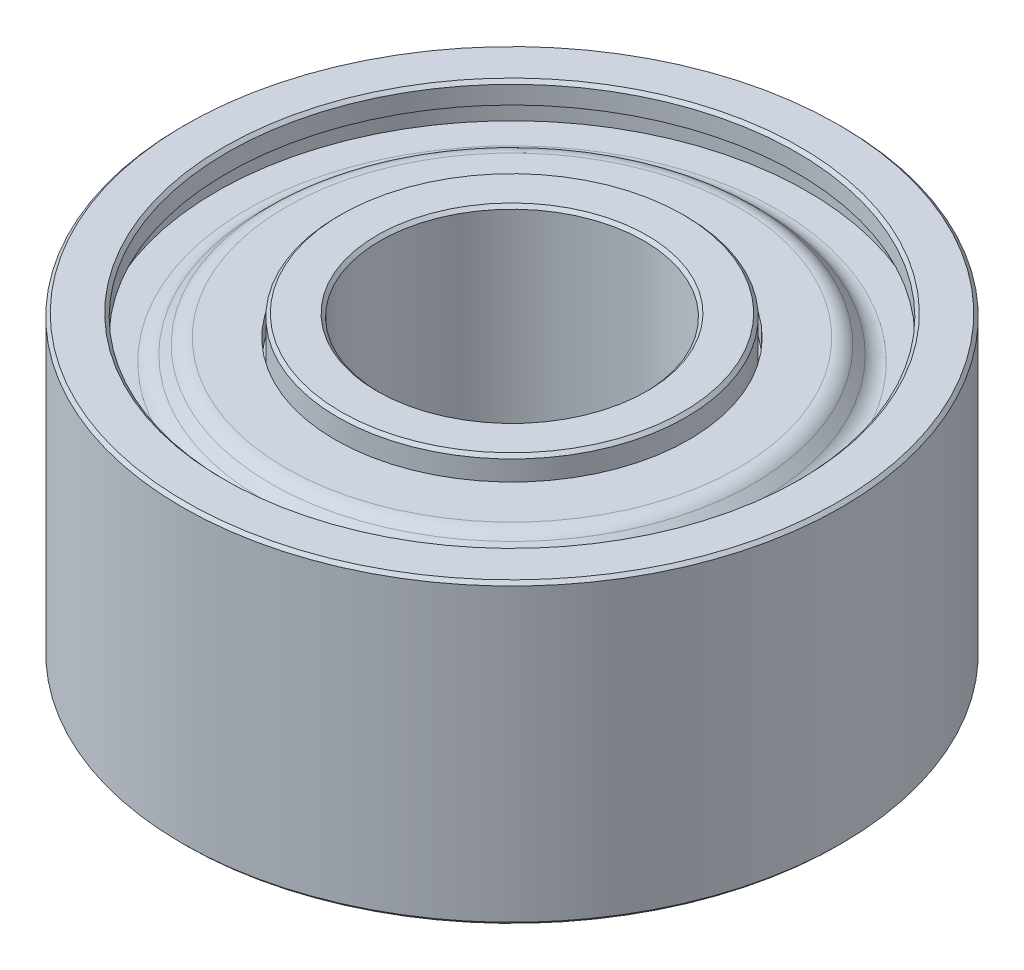
ISO-10303-21;
HEADER;
FILE_DESCRIPTION(('STEP AP214'),'2;1');
FILE_NAME('part.step','',(''),(''),'','','');
FILE_SCHEMA(('AUTOMOTIVE_DESIGN { 1 0 10303 214 1 1 1 1 }'));
ENDSEC;
DATA;
#1=APPLICATION_CONTEXT('core data for automotive mechanical design processes');
#2=APPLICATION_PROTOCOL_DEFINITION('international standard','automotive_design',2000,#1);
#3=PRODUCT_CONTEXT('',#1,'mechanical');
#4=PRODUCT('Part','Part','',(#3));
#5=PRODUCT_RELATED_PRODUCT_CATEGORY('part','',(#4));
#6=PRODUCT_DEFINITION_FORMATION('','',#4);
#7=PRODUCT_DEFINITION_CONTEXT('part definition',#1,'design');
#8=PRODUCT_DEFINITION('design','',#6,#7);
#9=PRODUCT_DEFINITION_SHAPE('','',#8);
#10=(LENGTH_UNIT() NAMED_UNIT(*) SI_UNIT(.MILLI.,.METRE.));
#11=(NAMED_UNIT(*) PLANE_ANGLE_UNIT() SI_UNIT($,.RADIAN.));
#12=(NAMED_UNIT(*) SI_UNIT($,.STERADIAN.) SOLID_ANGLE_UNIT());
#13=UNCERTAINTY_MEASURE_WITH_UNIT(LENGTH_MEASURE(1.E-05),#10,'distance_accuracy_value','');
#14=(GEOMETRIC_REPRESENTATION_CONTEXT(3) GLOBAL_UNCERTAINTY_ASSIGNED_CONTEXT((#13)) GLOBAL_UNIT_ASSIGNED_CONTEXT((#10,
#11,#12)) REPRESENTATION_CONTEXT('',''));
#15=CARTESIAN_POINT('',(0.,0.,0.));
#16=DIRECTION('',(0.,0.,1.));
#17=DIRECTION('',(1.,0.,0.));
#18=AXIS2_PLACEMENT_3D('',#15,#16,#17);
#19=CARTESIAN_POINT('',(0.,1.7907,0.));
#20=DIRECTION('',(0.,-1.,0.));
#21=DIRECTION('',(0.,0.,-1.));
#22=AXIS2_PLACEMENT_3D('',#19,#20,#21);
#23=CYLINDRICAL_SURFACE('',#22,1.5875);
#24=CARTESIAN_POINT('',(0.,-1.75260000003163,0.));
#25=DIRECTION('',(0.,-1.,0.));
#26=DIRECTION('',(0.,0.,-1.));
#27=AXIS2_PLACEMENT_3D('',#24,#25,#26);
#28=CIRCLE('',#27,1.58750000002783);
#29=CARTESIAN_POINT('',(0.,-1.75260000003163,-1.58750000002783));
#30=VERTEX_POINT('',#29);
#31=EDGE_CURVE('E410',#30,#30,#28,.T.);
#32=ORIENTED_EDGE('',*,*,#31,.T.);
#33=EDGE_LOOP('',(#32));
#34=FACE_BOUND('',#33,.T.);
#35=CARTESIAN_POINT('',(0.,1.75259999997479,0.));
#36=DIRECTION('',(0.,1.,0.));
#37=DIRECTION('',(0.,0.,1.));
#38=AXIS2_PLACEMENT_3D('',#35,#36,#37);
#39=CIRCLE('',#38,1.58750000008467);
#40=CARTESIAN_POINT('',(0.,1.75259999997479,1.58750000008467));
#41=VERTEX_POINT('',#40);
#42=EDGE_CURVE('E414',#41,#41,#39,.T.);
#43=ORIENTED_EDGE('',*,*,#42,.T.);
#44=EDGE_LOOP('',(#43));
#45=FACE_BOUND('',#44,.T.);
#46=ADVANCED_FACE('F17',(#34,#45),#23,.F.);
#47=CARTESIAN_POINT('',(0.,1.79069999984449,0.));
#48=DIRECTION('',(0.,1.,0.));
#49=DIRECTION('',(0.,0.,1.));
#50=AXIS2_PLACEMENT_3D('',#47,#48,#49);
#51=CONICAL_SURFACE('',#50,1.62559999989753,0.785398163397448);
#52=ORIENTED_EDGE('',*,*,#42,.F.);
#53=EDGE_LOOP('',(#52));
#54=FACE_BOUND('',#53,.T.);
#55=CARTESIAN_POINT('',(0.,1.79070000001502,0.));
#56=DIRECTION('',(0.,1.,0.));
#57=DIRECTION('',(0.,0.,1.));
#58=AXIS2_PLACEMENT_3D('',#55,#56,#57);
#59=CIRCLE('',#58,1.62560000006806);
#60=CARTESIAN_POINT('',(0.,1.79070000001502,1.62560000006806));
#61=VERTEX_POINT('',#60);
#62=EDGE_CURVE('E408',#61,#61,#59,.F.);
#63=ORIENTED_EDGE('',*,*,#62,.F.);
#64=EDGE_LOOP('',(#63));
#65=FACE_BOUND('',#64,.T.);
#66=ADVANCED_FACE('F186',(#54,#65),#51,.F.);
#67=CARTESIAN_POINT('',(0.,-1.79070000001502,0.));
#68=DIRECTION('',(0.,-1.,0.));
#69=DIRECTION('',(0.,0.,-1.));
#70=AXIS2_PLACEMENT_3D('',#67,#68,#69);
#71=CONICAL_SURFACE('',#70,1.62560000001122,0.785398163397448);
#72=CARTESIAN_POINT('',(0.,-1.79070000001502,0.));
#73=DIRECTION('',(0.,-1.,0.));
#74=DIRECTION('',(0.,0.,-1.));
#75=AXIS2_PLACEMENT_3D('',#72,#73,#74);
#76=CIRCLE('',#75,1.62560000001122);
#77=CARTESIAN_POINT('',(0.,-1.79070000001502,-1.62560000001122));
#78=VERTEX_POINT('',#77);
#79=EDGE_CURVE('E406',#78,#78,#76,.T.);
#80=ORIENTED_EDGE('',*,*,#79,.T.);
#81=EDGE_LOOP('',(#80));
#82=FACE_BOUND('',#81,.T.);
#83=ORIENTED_EDGE('',*,*,#31,.F.);
#84=EDGE_LOOP('',(#83));
#85=FACE_BOUND('',#84,.T.);
#86=ADVANCED_FACE('F183',(#82,#85),#71,.F.);
#87=CARTESIAN_POINT('',(0.,1.7907,0.));
#88=DIRECTION('',(0.,1.,0.));
#89=DIRECTION('',(0.,0.,1.));
#90=AXIS2_PLACEMENT_3D('',#87,#88,#89);
#91=PLANE('',#90);
#92=CARTESIAN_POINT('',(0.,1.79069999995818,0.));
#93=DIRECTION('',(0.,-1.,0.));
#94=DIRECTION('',(0.,0.,-1.));
#95=AXIS2_PLACEMENT_3D('',#92,#93,#94);
#96=CIRCLE('',#95,2.05740000001242);
#97=CARTESIAN_POINT('',(0.,1.79069999995818,-2.05740000001242));
#98=VERTEX_POINT('',#97);
#99=EDGE_CURVE('E403',#98,#98,#96,.T.);
#100=ORIENTED_EDGE('',*,*,#99,.F.);
#101=EDGE_LOOP('',(#100));
#102=FACE_BOUND('',#101,.T.);
#103=ORIENTED_EDGE('',*,*,#62,.T.);
#104=EDGE_LOOP('',(#103));
#105=FACE_BOUND('',#104,.T.);
#106=ADVANCED_FACE('F179',(#102,#105),#91,.T.);
#107=CARTESIAN_POINT('',(0.,-1.7907,0.));
#108=DIRECTION('',(0.,1.,0.));
#109=DIRECTION('',(0.,0.,1.));
#110=AXIS2_PLACEMENT_3D('',#107,#108,#109);
#111=PLANE('',#110);
#112=ORIENTED_EDGE('',*,*,#79,.F.);
#113=EDGE_LOOP('',(#112));
#114=FACE_BOUND('',#113,.T.);
#115=CARTESIAN_POINT('',(0.,-1.79070000001502,0.));
#116=DIRECTION('',(0.,1.,0.));
#117=DIRECTION('',(0.,0.,1.));
#118=AXIS2_PLACEMENT_3D('',#115,#116,#117);
#119=CIRCLE('',#118,2.05739999995558);
#120=CARTESIAN_POINT('',(0.,-1.79070000001502,2.05739999995558));
#121=VERTEX_POINT('',#120);
#122=EDGE_CURVE('E399',#121,#121,#119,.T.);
#123=ORIENTED_EDGE('',*,*,#122,.F.);
#124=EDGE_LOOP('',(#123));
#125=FACE_BOUND('',#124,.T.);
#126=ADVANCED_FACE('F175',(#114,#125),#111,.F.);
#127=CARTESIAN_POINT('',(0.,1.75259999991795,0.));
#128=DIRECTION('',(0.,-1.,0.));
#129=DIRECTION('',(0.,0.,-1.));
#130=AXIS2_PLACEMENT_3D('',#127,#128,#129);
#131=CONICAL_SURFACE('',#130,2.09550000005265,0.785398163397448);
#132=ORIENTED_EDGE('',*,*,#99,.T.);
#133=EDGE_LOOP('',(#132));
#134=FACE_BOUND('',#133,.T.);
#135=CARTESIAN_POINT('',(0.,1.7526,0.));
#136=DIRECTION('',(0.,1.,0.));
#137=DIRECTION('',(0.,0.,1.));
#138=AXIS2_PLACEMENT_3D('',#135,#136,#137);
#139=CIRCLE('',#138,2.0955);
#140=CARTESIAN_POINT('',(0.,1.7526,2.0955));
#141=VERTEX_POINT('',#140);
#142=EDGE_CURVE('E402',#141,#141,#139,.F.);
#143=ORIENTED_EDGE('',*,*,#142,.F.);
#144=EDGE_LOOP('',(#143));
#145=FACE_BOUND('',#144,.T.);
#146=ADVANCED_FACE('F171',(#134,#145),#131,.T.);
#147=CARTESIAN_POINT('',(0.,-1.75259999991795,0.));
#148=DIRECTION('',(0.,1.,0.));
#149=DIRECTION('',(0.,0.,1.));
#150=AXIS2_PLACEMENT_3D('',#147,#148,#149);
#151=CONICAL_SURFACE('',#150,2.09549999999581,0.785398162651472);
#152=CARTESIAN_POINT('',(0.,-1.7526,0.));
#153=DIRECTION('',(0.,-1.,0.));
#154=DIRECTION('',(0.,0.,-1.));
#155=AXIS2_PLACEMENT_3D('',#152,#153,#154);
#156=CIRCLE('',#155,2.0955);
#157=CARTESIAN_POINT('',(0.,-1.7526,-2.0955));
#158=VERTEX_POINT('',#157);
#159=EDGE_CURVE('E79',#158,#158,#156,.F.);
#160=ORIENTED_EDGE('',*,*,#159,.F.);
#161=EDGE_LOOP('',(#160));
#162=FACE_BOUND('',#161,.T.);
#163=ORIENTED_EDGE('',*,*,#122,.T.);
#164=EDGE_LOOP('',(#163));
#165=FACE_BOUND('',#164,.T.);
#166=ADVANCED_FACE('F167',(#162,#165),#151,.T.);
#167=CARTESIAN_POINT('',(0.,1.5367,0.));
#168=DIRECTION('',(0.,1.,0.));
#169=DIRECTION('',(0.,0.,1.));
#170=AXIS2_PLACEMENT_3D('',#167,#168,#169);
#171=CYLINDRICAL_SURFACE('',#170,2.0955);
#172=CARTESIAN_POINT('',(0.,1.2827,0.));
#173=DIRECTION('',(0.,1.,0.));
#174=DIRECTION('',(0.,0.,1.));
#175=AXIS2_PLACEMENT_3D('',#172,#173,#174);
#176=CIRCLE('',#175,2.0955);
#177=CARTESIAN_POINT('',(0.,1.2827,2.0955));
#178=VERTEX_POINT('',#177);
#179=EDGE_CURVE('E396',#178,#178,#176,.F.);
#180=ORIENTED_EDGE('',*,*,#179,.F.);
#181=EDGE_LOOP('',(#180));
#182=FACE_BOUND('',#181,.T.);
#183=ORIENTED_EDGE('',*,*,#142,.T.);
#184=EDGE_LOOP('',(#183));
#185=FACE_BOUND('',#184,.T.);
#186=ADVANCED_FACE('F163',(#182,#185),#171,.T.);
#187=CARTESIAN_POINT('',(0.,-1.5367,0.));
#188=DIRECTION('',(0.,-1.,0.));
#189=DIRECTION('',(0.,0.,-1.));
#190=AXIS2_PLACEMENT_3D('',#187,#188,#189);
#191=CYLINDRICAL_SURFACE('',#190,2.0955);
#192=ORIENTED_EDGE('',*,*,#159,.T.);
#193=EDGE_LOOP('',(#192));
#194=FACE_BOUND('',#193,.T.);
#195=CARTESIAN_POINT('',(0.,-1.2827,0.));
#196=DIRECTION('',(0.,-1.,0.));
#197=DIRECTION('',(0.,0.,-1.));
#198=AXIS2_PLACEMENT_3D('',#195,#196,#197);
#199=CIRCLE('',#198,2.0955);
#200=CARTESIAN_POINT('',(0.,-1.2827,-2.0955));
#201=VERTEX_POINT('',#200);
#202=EDGE_CURVE('E393',#201,#201,#199,.F.);
#203=ORIENTED_EDGE('',*,*,#202,.F.);
#204=EDGE_LOOP('',(#203));
#205=FACE_BOUND('',#204,.T.);
#206=ADVANCED_FACE('F159',(#194,#205),#191,.T.);
#207=CARTESIAN_POINT('',(0.,1.2827,0.));
#208=DIRECTION('',(0.,1.,0.));
#209=DIRECTION('',(0.,0.,1.));
#210=AXIS2_PLACEMENT_3D('',#207,#208,#209);
#211=PLANE('',#210);
#212=CARTESIAN_POINT('',(0.,1.2827,0.));
#213=DIRECTION('',(0.,1.,0.));
#214=DIRECTION('',(0.,0.,1.));
#215=AXIS2_PLACEMENT_3D('',#212,#213,#214);
#216=CIRCLE('',#215,2.129777832113);
#217=CARTESIAN_POINT('',(0.,1.2827,2.129777832113));
#218=VERTEX_POINT('',#217);
#219=EDGE_CURVE('E390',#218,#218,#216,.T.);
#220=ORIENTED_EDGE('',*,*,#219,.T.);
#221=EDGE_LOOP('',(#220));
#222=FACE_BOUND('',#221,.T.);
#223=ORIENTED_EDGE('',*,*,#179,.T.);
#224=EDGE_LOOP('',(#223));
#225=FACE_BOUND('',#224,.T.);
#226=ADVANCED_FACE('F155',(#222,#225),#211,.T.);
#227=CARTESIAN_POINT('',(0.,-1.2827,0.));
#228=DIRECTION('',(0.,-1.,0.));
#229=DIRECTION('',(0.,0.,-1.));
#230=AXIS2_PLACEMENT_3D('',#227,#228,#229);
#231=PLANE('',#230);
#232=ORIENTED_EDGE('',*,*,#202,.T.);
#233=EDGE_LOOP('',(#232));
#234=FACE_BOUND('',#233,.T.);
#235=CARTESIAN_POINT('',(0.,-1.2827,0.));
#236=DIRECTION('',(0.,-1.,0.));
#237=DIRECTION('',(0.,0.,-1.));
#238=AXIS2_PLACEMENT_3D('',#235,#236,#237);
#239=CIRCLE('',#238,2.129777832113);
#240=CARTESIAN_POINT('',(0.,-1.2827,-2.129777832113));
#241=VERTEX_POINT('',#240);
#242=EDGE_CURVE('E387',#241,#241,#239,.T.);
#243=ORIENTED_EDGE('',*,*,#242,.T.);
#244=EDGE_LOOP('',(#243));
#245=FACE_BOUND('',#244,.T.);
#246=ADVANCED_FACE('F151',(#234,#245),#231,.T.);
#247=CARTESIAN_POINT('',(0.,1.2827,0.));
#248=DIRECTION('',(0.,1.,0.));
#249=DIRECTION('',(0.,0.,1.));
#250=AXIS2_PLACEMENT_3D('',#247,#248,#249);
#251=CYLINDRICAL_SURFACE('',#250,2.129777832113);
#252=CARTESIAN_POINT('',(0.,1.5367,0.));
#253=DIRECTION('',(0.,1.,0.));
#254=DIRECTION('',(0.,0.,1.));
#255=AXIS2_PLACEMENT_3D('',#252,#253,#254);
#256=CIRCLE('',#255,2.129777832113);
#257=CARTESIAN_POINT('',(0.,1.5367,2.129777832113));
#258=VERTEX_POINT('',#257);
#259=EDGE_CURVE('E384',#258,#258,#256,.F.);
#260=ORIENTED_EDGE('',*,*,#259,.F.);
#261=EDGE_LOOP('',(#260));
#262=FACE_BOUND('',#261,.T.);
#263=ORIENTED_EDGE('',*,*,#219,.F.);
#264=EDGE_LOOP('',(#263));
#265=FACE_BOUND('',#264,.T.);
#266=ADVANCED_FACE('F147',(#262,#265),#251,.F.);
#267=CARTESIAN_POINT('',(0.,-1.2827,0.));
#268=DIRECTION('',(0.,-1.,0.));
#269=DIRECTION('',(0.,0.,-1.));
#270=AXIS2_PLACEMENT_3D('',#267,#268,#269);
#271=CYLINDRICAL_SURFACE('',#270,2.129777832113);
#272=ORIENTED_EDGE('',*,*,#242,.F.);
#273=EDGE_LOOP('',(#272));
#274=FACE_BOUND('',#273,.T.);
#275=CARTESIAN_POINT('',(0.,-1.5367,0.));
#276=DIRECTION('',(0.,-1.,0.));
#277=DIRECTION('',(0.,0.,-1.));
#278=AXIS2_PLACEMENT_3D('',#275,#276,#277);
#279=CIRCLE('',#278,2.129777832113);
#280=CARTESIAN_POINT('',(0.,-1.5367,-2.129777832113));
#281=VERTEX_POINT('',#280);
#282=EDGE_CURVE('E65',#281,#281,#279,.F.);
#283=ORIENTED_EDGE('',*,*,#282,.F.);
#284=EDGE_LOOP('',(#283));
#285=FACE_BOUND('',#284,.T.);
#286=ADVANCED_FACE('F143',(#274,#285),#271,.F.);
#287=CARTESIAN_POINT('',(0.,1.5367,0.));
#288=DIRECTION('',(0.,1.,0.));
#289=DIRECTION('',(0.,0.,1.));
#290=AXIS2_PLACEMENT_3D('',#287,#288,#289);
#291=PLANE('',#290);
#292=CARTESIAN_POINT('',(0.,1.5367,0.));
#293=DIRECTION('',(0.,-1.,0.));
#294=DIRECTION('',(0.,0.,-1.));
#295=AXIS2_PLACEMENT_3D('',#292,#293,#294);
#296=CIRCLE('',#295,2.7215453125408);
#297=CARTESIAN_POINT('',(0.,1.5367,-2.7215453125408));
#298=VERTEX_POINT('',#297);
#299=CARTESIAN_POINT('',(0.,1.5367,2.7215453125408));
#300=VERTEX_POINT('',#299);
#301=EDGE_CURVE('E63',#298,#300,#296,.T.);
#302=ORIENTED_EDGE('',*,*,#301,.F.);
#303=CARTESIAN_POINT('',(0.,1.5367,0.));
#304=DIRECTION('',(0.,-1.,0.));
#305=DIRECTION('',(0.,0.,1.));
#306=AXIS2_PLACEMENT_3D('',#303,#304,#305);
#307=CIRCLE('',#306,2.7215453125408);
#308=EDGE_CURVE('E57',#300,#298,#307,.T.);
#309=ORIENTED_EDGE('',*,*,#308,.F.);
#310=EDGE_LOOP('',(#302,#309));
#311=FACE_BOUND('',#310,.T.);
#312=ORIENTED_EDGE('',*,*,#259,.T.);
#313=EDGE_LOOP('',(#312));
#314=FACE_BOUND('',#313,.T.);
#315=ADVANCED_FACE('F61',(#311,#314),#291,.T.);
#316=CARTESIAN_POINT('',(0.,-1.5367,0.));
#317=DIRECTION('',(0.,-1.,0.));
#318=DIRECTION('',(0.,0.,-1.));
#319=AXIS2_PLACEMENT_3D('',#316,#317,#318);
#320=PLANE('',#319);
#321=ORIENTED_EDGE('',*,*,#282,.T.);
#322=EDGE_LOOP('',(#321));
#323=FACE_BOUND('',#322,.T.);
#324=CARTESIAN_POINT('',(0.,-1.5367,0.));
#325=DIRECTION('',(0.,1.,0.));
#326=DIRECTION('',(0.,0.,1.));
#327=AXIS2_PLACEMENT_3D('',#324,#325,#326);
#328=CIRCLE('',#327,2.72154531254081);
#329=CARTESIAN_POINT('',(0.,-1.5367,2.72154531254081));
#330=VERTEX_POINT('',#329);
#331=CARTESIAN_POINT('',(0.,-1.5367,-2.72154531254081));
#332=VERTEX_POINT('',#331);
#333=EDGE_CURVE('E106',#330,#332,#328,.T.);
#334=ORIENTED_EDGE('',*,*,#333,.F.);
#335=CARTESIAN_POINT('',(0.,-1.5367,0.));
#336=DIRECTION('',(0.,1.,0.));
#337=DIRECTION('',(0.,0.,-1.));
#338=AXIS2_PLACEMENT_3D('',#335,#336,#337);
#339=CIRCLE('',#338,2.72154531254081);
#340=EDGE_CURVE('E71',#332,#330,#339,.T.);
#341=ORIENTED_EDGE('',*,*,#340,.F.);
#342=EDGE_LOOP('',(#334,#341));
#343=FACE_BOUND('',#342,.T.);
#344=ADVANCED_FACE('F92',(#323,#343),#320,.T.);
#345=CARTESIAN_POINT('',(0.,1.2827,0.));
#346=DIRECTION('',(0.,1.,0.));
#347=DIRECTION('',(0.,0.,1.));
#348=AXIS2_PLACEMENT_3D('',#345,#346,#347);
#349=TOROIDAL_SURFACE('',#348,2.7215453125408,0.254);
#350=ORIENTED_EDGE('',*,*,#308,.T.);
#351=ORIENTED_EDGE('',*,*,#301,.T.);
#352=EDGE_LOOP('',(#350,#351));
#353=FACE_BOUND('',#352,.T.);
#354=CARTESIAN_POINT('',(0.,1.46230512245893,0.));
#355=DIRECTION('',(0.,-1.,0.));
#356=DIRECTION('',(0.,0.,-1.));
#357=AXIS2_PLACEMENT_3D('',#354,#355,#356);
#358=CIRCLE('',#357,2.90115043492278);
#359=CARTESIAN_POINT('',(0.,1.46230512245893,-2.90115043492278));
#360=VERTEX_POINT('',#359);
#361=EDGE_CURVE('E101',#360,#360,#358,.T.);
#362=ORIENTED_EDGE('',*,*,#361,.F.);
#363=EDGE_LOOP('',(#362));
#364=FACE_BOUND('',#363,.T.);
#365=ADVANCED_FACE('F69',(#353,#364),#349,.T.);
#366=CARTESIAN_POINT('',(0.,-1.2827,0.));
#367=DIRECTION('',(0.,-1.,0.));
#368=DIRECTION('',(0.,0.,-1.));
#369=AXIS2_PLACEMENT_3D('',#366,#367,#368);
#370=TOROIDAL_SURFACE('',#369,2.72154531254081,0.254);
#371=ORIENTED_EDGE('',*,*,#340,.T.);
#372=ORIENTED_EDGE('',*,*,#333,.T.);
#373=EDGE_LOOP('',(#371,#372));
#374=FACE_BOUND('',#373,.T.);
#375=CARTESIAN_POINT('',(0.,-1.46230512240209,0.));
#376=DIRECTION('',(0.,1.,0.));
#377=DIRECTION('',(0.,0.,1.));
#378=AXIS2_PLACEMENT_3D('',#375,#376,#377);
#379=CIRCLE('',#378,2.90115043497963);
#380=CARTESIAN_POINT('',(0.,-1.46230512240209,2.90115043497963));
#381=VERTEX_POINT('',#380);
#382=EDGE_CURVE('E345',#381,#381,#379,.T.);
#383=ORIENTED_EDGE('',*,*,#382,.F.);
#384=EDGE_LOOP('',(#383));
#385=FACE_BOUND('',#384,.T.);
#386=ADVANCED_FACE('F91',(#374,#385),#370,.T.);
#387=CARTESIAN_POINT('',(0.,1.35709487761915,0.));
#388=DIRECTION('',(0.,-1.,0.));
#389=DIRECTION('',(0.,0.,-1.));
#390=AXIS2_PLACEMENT_3D('',#387,#388,#389);
#391=CONICAL_SURFACE('',#390,3.00636067976257,0.785398163397448);
#392=CARTESIAN_POINT('',(0.,1.35709487757862,0.));
#393=DIRECTION('',(0.,1.,0.));
#394=DIRECTION('',(0.,0.,1.));
#395=AXIS2_PLACEMENT_3D('',#392,#393,#394);
#396=CIRCLE('',#395,3.00636067980495);
#397=CARTESIAN_POINT('',(0.,1.35709487757862,3.00636067980495));
#398=VERTEX_POINT('',#397);
#399=EDGE_CURVE('E349',#398,#398,#396,.T.);
#400=ORIENTED_EDGE('',*,*,#399,.T.);
#401=EDGE_LOOP('',(#400));
#402=FACE_BOUND('',#401,.T.);
#403=ORIENTED_EDGE('',*,*,#361,.T.);
#404=EDGE_LOOP('',(#403));
#405=FACE_BOUND('',#404,.T.);
#406=ADVANCED_FACE('F504',(#402,#405),#391,.T.);
#407=CARTESIAN_POINT('',(0.,-1.3570948775623,0.));
#408=DIRECTION('',(0.,1.,0.));
#409=DIRECTION('',(0.,0.,1.));
#410=AXIS2_PLACEMENT_3D('',#407,#408,#409);
#411=CONICAL_SURFACE('',#410,3.00636067981941,0.785398163397448);
#412=CARTESIAN_POINT('',(0.,-1.35709487757862,0.));
#413=DIRECTION('',(0.,-1.,0.));
#414=DIRECTION('',(0.,0.,-1.));
#415=AXIS2_PLACEMENT_3D('',#412,#413,#414);
#416=CIRCLE('',#415,3.00636067980496);
#417=CARTESIAN_POINT('',(0.,-1.35709487757862,-3.00636067980496));
#418=VERTEX_POINT('',#417);
#419=EDGE_CURVE('E354',#418,#418,#416,.T.);
#420=ORIENTED_EDGE('',*,*,#419,.T.);
#421=EDGE_LOOP('',(#420));
#422=FACE_BOUND('',#421,.T.);
#423=ORIENTED_EDGE('',*,*,#382,.T.);
#424=EDGE_LOOP('',(#423));
#425=FACE_BOUND('',#424,.T.);
#426=ADVANCED_FACE('F510',(#422,#425),#411,.T.);
#427=CARTESIAN_POINT('',(0.,1.5367,0.));
#428=DIRECTION('',(0.,1.,0.));
#429=DIRECTION('',(0.,0.,1.));
#430=AXIS2_PLACEMENT_3D('',#427,#428,#429);
#431=TOROIDAL_SURFACE('',#430,3.18596580222634,0.254);
#432=ORIENTED_EDGE('',*,*,#399,.F.);
#433=EDGE_LOOP('',(#432));
#434=FACE_BOUND('',#433,.T.);
#435=CARTESIAN_POINT('',(0.,1.2827,0.));
#436=DIRECTION('',(0.,1.,0.));
#437=DIRECTION('',(0.,0.,-1.));
#438=AXIS2_PLACEMENT_3D('',#435,#436,#437);
#439=CIRCLE('',#438,3.18596580222634);
#440=CARTESIAN_POINT('',(0.,1.2827,3.18596580222634));
#441=VERTEX_POINT('',#440);
#442=CARTESIAN_POINT('',(0.,1.2827,-3.18596580222634));
#443=VERTEX_POINT('',#442);
#444=EDGE_CURVE('E281',#441,#443,#439,.F.);
#445=ORIENTED_EDGE('',*,*,#444,.F.);
#446=CARTESIAN_POINT('',(0.,1.2827,0.));
#447=DIRECTION('',(0.,1.,0.));
#448=DIRECTION('',(0.,0.,1.));
#449=AXIS2_PLACEMENT_3D('',#446,#447,#448);
#450=CIRCLE('',#449,3.18596580222634);
#451=EDGE_CURVE('E291',#443,#441,#450,.F.);
#452=ORIENTED_EDGE('',*,*,#451,.F.);
#453=EDGE_LOOP('',(#445,#452));
#454=FACE_BOUND('',#453,.T.);
#455=ADVANCED_FACE('F306',(#434,#454),#431,.F.);
#456=CARTESIAN_POINT('',(0.,-1.5367,0.));
#457=DIRECTION('',(0.,-1.,0.));
#458=DIRECTION('',(0.,0.,-1.));
#459=AXIS2_PLACEMENT_3D('',#456,#457,#458);
#460=TOROIDAL_SURFACE('',#459,3.18596580222634,0.254);
#461=ORIENTED_EDGE('',*,*,#419,.F.);
#462=EDGE_LOOP('',(#461));
#463=FACE_BOUND('',#462,.T.);
#464=CARTESIAN_POINT('',(0.,-1.2827,0.));
#465=DIRECTION('',(0.,-1.,0.));
#466=DIRECTION('',(0.,0.,1.));
#467=AXIS2_PLACEMENT_3D('',#464,#465,#466);
#468=CIRCLE('',#467,3.18596580222634);
#469=CARTESIAN_POINT('',(0.,-1.2827,-3.18596580222634));
#470=VERTEX_POINT('',#469);
#471=CARTESIAN_POINT('',(0.,-1.2827,3.18596580222634));
#472=VERTEX_POINT('',#471);
#473=EDGE_CURVE('E369',#470,#472,#468,.F.);
#474=ORIENTED_EDGE('',*,*,#473,.F.);
#475=CARTESIAN_POINT('',(0.,-1.2827,0.));
#476=DIRECTION('',(0.,-1.,0.));
#477=DIRECTION('',(0.,0.,-1.));
#478=AXIS2_PLACEMENT_3D('',#475,#476,#477);
#479=CIRCLE('',#478,3.18596580222634);
#480=EDGE_CURVE('E36',#472,#470,#479,.F.);
#481=ORIENTED_EDGE('',*,*,#480,.F.);
#482=EDGE_LOOP('',(#474,#481));
#483=FACE_BOUND('',#482,.T.);
#484=ADVANCED_FACE('F302',(#463,#483),#460,.F.);
#485=CARTESIAN_POINT('',(0.,1.2827,0.));
#486=DIRECTION('',(0.,1.,0.));
#487=DIRECTION('',(0.,0.,1.));
#488=AXIS2_PLACEMENT_3D('',#485,#486,#487);
#489=PLANE('',#488);
#490=ORIENTED_EDGE('',*,*,#444,.T.);
#491=ORIENTED_EDGE('',*,*,#451,.T.);
#492=EDGE_LOOP('',(#490,#491));
#493=FACE_BOUND('',#492,.T.);
#494=CARTESIAN_POINT('',(0.,1.2827,0.));
#495=DIRECTION('',(0.,1.,0.));
#496=DIRECTION('',(0.,0.,1.));
#497=AXIS2_PLACEMENT_3D('',#494,#495,#496);
#498=CIRCLE('',#497,3.556);
#499=CARTESIAN_POINT('',(0.,1.2827,3.556));
#500=VERTEX_POINT('',#499);
#501=EDGE_CURVE('E371',#500,#500,#498,.T.);
#502=ORIENTED_EDGE('',*,*,#501,.T.);
#503=EDGE_LOOP('',(#502));
#504=FACE_BOUND('',#503,.T.);
#505=ADVANCED_FACE('F258',(#493,#504),#489,.T.);
#506=CARTESIAN_POINT('',(0.,-1.2827,0.));
#507=DIRECTION('',(0.,-1.,0.));
#508=DIRECTION('',(0.,0.,-1.));
#509=AXIS2_PLACEMENT_3D('',#506,#507,#508);
#510=PLANE('',#509);
#511=CARTESIAN_POINT('',(0.,-1.2827,0.));
#512=DIRECTION('',(0.,-1.,0.));
#513=DIRECTION('',(0.,0.,-1.));
#514=AXIS2_PLACEMENT_3D('',#511,#512,#513);
#515=CIRCLE('',#514,3.556);
#516=CARTESIAN_POINT('',(0.,-1.2827,-3.556));
#517=VERTEX_POINT('',#516);
#518=EDGE_CURVE('E373',#517,#517,#515,.T.);
#519=ORIENTED_EDGE('',*,*,#518,.T.);
#520=EDGE_LOOP('',(#519));
#521=FACE_BOUND('',#520,.T.);
#522=ORIENTED_EDGE('',*,*,#473,.T.);
#523=ORIENTED_EDGE('',*,*,#480,.T.);
#524=EDGE_LOOP('',(#522,#523));
#525=FACE_BOUND('',#524,.T.);
#526=ADVANCED_FACE('F253',(#521,#525),#510,.T.);
#527=CARTESIAN_POINT('',(0.,1.2827,0.));
#528=DIRECTION('',(0.,1.,0.));
#529=DIRECTION('',(0.,0.,1.));
#530=AXIS2_PLACEMENT_3D('',#527,#528,#529);
#531=CYLINDRICAL_SURFACE('',#530,3.556);
#532=ORIENTED_EDGE('',*,*,#501,.F.);
#533=EDGE_LOOP('',(#532));
#534=FACE_BOUND('',#533,.T.);
#535=CARTESIAN_POINT('',(0.,1.5367,0.));
#536=DIRECTION('',(0.,1.,0.));
#537=DIRECTION('',(0.,0.,1.));
#538=AXIS2_PLACEMENT_3D('',#535,#536,#537);
#539=CIRCLE('',#538,3.556);
#540=CARTESIAN_POINT('',(0.,1.5367,3.556));
#541=VERTEX_POINT('',#540);
#542=EDGE_CURVE('E378',#541,#541,#539,.T.);
#543=ORIENTED_EDGE('',*,*,#542,.T.);
#544=EDGE_LOOP('',(#543));
#545=FACE_BOUND('',#544,.T.);
#546=ADVANCED_FACE('F249',(#534,#545),#531,.F.);
#547=CARTESIAN_POINT('',(0.,-1.2827,0.));
#548=DIRECTION('',(0.,-1.,0.));
#549=DIRECTION('',(0.,0.,-1.));
#550=AXIS2_PLACEMENT_3D('',#547,#548,#549);
#551=CYLINDRICAL_SURFACE('',#550,3.556);
#552=CARTESIAN_POINT('',(0.,-1.5367,0.));
#553=DIRECTION('',(0.,-1.,0.));
#554=DIRECTION('',(0.,0.,-1.));
#555=AXIS2_PLACEMENT_3D('',#552,#553,#554);
#556=CIRCLE('',#555,3.556);
#557=CARTESIAN_POINT('',(0.,-1.5367,-3.556));
#558=VERTEX_POINT('',#557);
#559=EDGE_CURVE('E440',#558,#558,#556,.T.);
#560=ORIENTED_EDGE('',*,*,#559,.T.);
#561=EDGE_LOOP('',(#560));
#562=FACE_BOUND('',#561,.T.);
#563=ORIENTED_EDGE('',*,*,#518,.F.);
#564=EDGE_LOOP('',(#563));
#565=FACE_BOUND('',#564,.T.);
#566=ADVANCED_FACE('F245',(#562,#565),#551,.F.);
#567=CARTESIAN_POINT('',(0.,1.5367,0.));
#568=DIRECTION('',(0.,1.,0.));
#569=DIRECTION('',(0.,0.,1.));
#570=AXIS2_PLACEMENT_3D('',#567,#568,#569);
#571=PLANE('',#570);
#572=CARTESIAN_POINT('',(0.,1.5367,0.));
#573=DIRECTION('',(0.,1.,0.));
#574=DIRECTION('',(0.,0.,1.));
#575=AXIS2_PLACEMENT_3D('',#572,#573,#574);
#576=CIRCLE('',#575,3.429);
#577=CARTESIAN_POINT('',(0.,1.5367,3.429));
#578=VERTEX_POINT('',#577);
#579=EDGE_CURVE('E437',#578,#578,#576,.T.);
#580=ORIENTED_EDGE('',*,*,#579,.T.);
#581=EDGE_LOOP('',(#580));
#582=FACE_BOUND('',#581,.T.);
#583=ORIENTED_EDGE('',*,*,#542,.F.);
#584=EDGE_LOOP('',(#583));
#585=FACE_BOUND('',#584,.T.);
#586=ADVANCED_FACE('F241',(#582,#585),#571,.F.);
#587=CARTESIAN_POINT('',(0.,-1.5367,0.));
#588=DIRECTION('',(0.,-1.,0.));
#589=DIRECTION('',(0.,0.,-1.));
#590=AXIS2_PLACEMENT_3D('',#587,#588,#589);
#591=PLANE('',#590);
#592=ORIENTED_EDGE('',*,*,#559,.F.);
#593=EDGE_LOOP('',(#592));
#594=FACE_BOUND('',#593,.T.);
#595=CARTESIAN_POINT('',(0.,-1.5367,0.));
#596=DIRECTION('',(0.,-1.,0.));
#597=DIRECTION('',(0.,0.,-1.));
#598=AXIS2_PLACEMENT_3D('',#595,#596,#597);
#599=CIRCLE('',#598,3.429);
#600=CARTESIAN_POINT('',(0.,-1.5367,-3.429));
#601=VERTEX_POINT('',#600);
#602=EDGE_CURVE('E433',#601,#601,#599,.T.);
#603=ORIENTED_EDGE('',*,*,#602,.T.);
#604=EDGE_LOOP('',(#603));
#605=FACE_BOUND('',#604,.T.);
#606=ADVANCED_FACE('F237',(#594,#605),#591,.F.);
#607=CARTESIAN_POINT('',(0.,1.5367,0.));
#608=DIRECTION('',(0.,1.,0.));
#609=DIRECTION('',(0.,0.,1.));
#610=AXIS2_PLACEMENT_3D('',#607,#608,#609);
#611=CYLINDRICAL_SURFACE('',#610,3.429);
#612=ORIENTED_EDGE('',*,*,#579,.F.);
#613=EDGE_LOOP('',(#612));
#614=FACE_BOUND('',#613,.T.);
#615=CARTESIAN_POINT('',(0.,1.75260000003163,0.));
#616=DIRECTION('',(0.,1.,0.));
#617=DIRECTION('',(0.,0.,1.));
#618=AXIS2_PLACEMENT_3D('',#615,#616,#617);
#619=CIRCLE('',#618,3.42899999998281);
#620=CARTESIAN_POINT('',(0.,1.75260000003163,3.42899999998281));
#621=VERTEX_POINT('',#620);
#622=EDGE_CURVE('E436',#621,#621,#619,.T.);
#623=ORIENTED_EDGE('',*,*,#622,.T.);
#624=EDGE_LOOP('',(#623));
#625=FACE_BOUND('',#624,.T.);
#626=ADVANCED_FACE('F233',(#614,#625),#611,.F.);
#627=CARTESIAN_POINT('',(0.,-1.5367,0.));
#628=DIRECTION('',(0.,-1.,0.));
#629=DIRECTION('',(0.,0.,-1.));
#630=AXIS2_PLACEMENT_3D('',#627,#628,#629);
#631=CYLINDRICAL_SURFACE('',#630,3.429);
#632=CARTESIAN_POINT('',(0.,-1.75259999997479,0.));
#633=DIRECTION('',(0.,-1.,0.));
#634=DIRECTION('',(0.,0.,-1.));
#635=AXIS2_PLACEMENT_3D('',#632,#633,#634);
#636=CIRCLE('',#635,3.42899999998281);
#637=CARTESIAN_POINT('',(0.,-1.75259999997479,-3.42899999998281));
#638=VERTEX_POINT('',#637);
#639=EDGE_CURVE('E432',#638,#638,#636,.T.);
#640=ORIENTED_EDGE('',*,*,#639,.T.);
#641=EDGE_LOOP('',(#640));
#642=FACE_BOUND('',#641,.T.);
#643=ORIENTED_EDGE('',*,*,#602,.F.);
#644=EDGE_LOOP('',(#643));
#645=FACE_BOUND('',#644,.T.);
#646=ADVANCED_FACE('F229',(#642,#645),#631,.F.);
#647=CARTESIAN_POINT('',(0.,1.79069999990134,0.));
#648=DIRECTION('',(0.,1.,0.));
#649=DIRECTION('',(-1.,0.,0.));
#650=AXIS2_PLACEMENT_3D('',#647,#648,#649);
#651=CONICAL_SURFACE('',#650,3.46709999990935,0.785398164143425);
#652=ORIENTED_EDGE('',*,*,#622,.F.);
#653=EDGE_LOOP('',(#652));
#654=FACE_BOUND('',#653,.T.);
#655=CARTESIAN_POINT('',(0.,1.79069999995818,0.));
#656=DIRECTION('',(0.,1.,0.));
#657=DIRECTION('',(-1.,0.,0.));
#658=AXIS2_PLACEMENT_3D('',#655,#656,#657);
#659=CIRCLE('',#658,3.46709999996619);
#660=CARTESIAN_POINT('',(-3.46709999996619,1.79069999995818,0.));
#661=VERTEX_POINT('',#660);
#662=EDGE_CURVE('E429',#661,#661,#659,.F.);
#663=ORIENTED_EDGE('',*,*,#662,.F.);
#664=EDGE_LOOP('',(#663));
#665=FACE_BOUND('',#664,.T.);
#666=ADVANCED_FACE('F225',(#654,#665),#651,.F.);
#667=CARTESIAN_POINT('',(0.,-1.79069999995818,0.));
#668=DIRECTION('',(0.,-1.,0.));
#669=DIRECTION('',(0.,0.,-1.));
#670=AXIS2_PLACEMENT_3D('',#667,#668,#669);
#671=CONICAL_SURFACE('',#670,3.46709999996619,0.785398163397448);
#672=CARTESIAN_POINT('',(0.,-1.79069999995818,0.));
#673=DIRECTION('',(0.,-1.,0.));
#674=DIRECTION('',(0.,0.,-1.));
#675=AXIS2_PLACEMENT_3D('',#672,#673,#674);
#676=CIRCLE('',#675,3.46709999996619);
#677=CARTESIAN_POINT('',(0.,-1.79069999995818,-3.46709999996619));
#678=VERTEX_POINT('',#677);
#679=EDGE_CURVE('E426',#678,#678,#676,.T.);
#680=ORIENTED_EDGE('',*,*,#679,.T.);
#681=EDGE_LOOP('',(#680));
#682=FACE_BOUND('',#681,.T.);
#683=ORIENTED_EDGE('',*,*,#639,.F.);
#684=EDGE_LOOP('',(#683));
#685=FACE_BOUND('',#684,.T.);
#686=ADVANCED_FACE('F221',(#682,#685),#671,.F.);
#687=CARTESIAN_POINT('',(0.,1.7907,0.));
#688=DIRECTION('',(0.,1.,0.));
#689=DIRECTION('',(0.,0.,1.));
#690=AXIS2_PLACEMENT_3D('',#687,#688,#689);
#691=PLANE('',#690);
#692=CARTESIAN_POINT('',(0.,1.79069999995818,0.));
#693=DIRECTION('',(0.,-1.,0.));
#694=DIRECTION('',(0.,0.,-1.));
#695=AXIS2_PLACEMENT_3D('',#692,#693,#694);
#696=CIRCLE('',#695,3.93065000002935);
#697=CARTESIAN_POINT('',(0.,1.79069999995818,-3.93065000002935));
#698=VERTEX_POINT('',#697);
#699=EDGE_CURVE('E423',#698,#698,#696,.T.);
#700=ORIENTED_EDGE('',*,*,#699,.F.);
#701=EDGE_LOOP('',(#700));
#702=FACE_BOUND('',#701,.T.);
#703=ORIENTED_EDGE('',*,*,#662,.T.);
#704=EDGE_LOOP('',(#703));
#705=FACE_BOUND('',#704,.T.);
#706=ADVANCED_FACE('F217',(#702,#705),#691,.T.);
#707=CARTESIAN_POINT('',(0.,-1.7907,0.));
#708=DIRECTION('',(0.,1.,0.));
#709=DIRECTION('',(0.,0.,1.));
#710=AXIS2_PLACEMENT_3D('',#707,#708,#709);
#711=PLANE('',#710);
#712=ORIENTED_EDGE('',*,*,#679,.F.);
#713=EDGE_LOOP('',(#712));
#714=FACE_BOUND('',#713,.T.);
#715=CARTESIAN_POINT('',(0.,-1.79069999995818,0.));
#716=DIRECTION('',(0.,1.,0.));
#717=DIRECTION('',(0.,0.,1.));
#718=AXIS2_PLACEMENT_3D('',#715,#716,#717);
#719=CIRCLE('',#718,3.93065000002935);
#720=CARTESIAN_POINT('',(0.,-1.79069999995818,3.93065000002935));
#721=VERTEX_POINT('',#720);
#722=EDGE_CURVE('E420',#721,#721,#719,.T.);
#723=ORIENTED_EDGE('',*,*,#722,.F.);
#724=EDGE_LOOP('',(#723));
#725=FACE_BOUND('',#724,.T.);
#726=ADVANCED_FACE('F213',(#714,#725),#711,.F.);
#727=CARTESIAN_POINT('',(0.,1.75260000008848,0.));
#728=DIRECTION('',(0.,-1.,0.));
#729=DIRECTION('',(0.,0.,-1.));
#730=AXIS2_PLACEMENT_3D('',#727,#728,#729);
#731=CONICAL_SURFACE('',#730,3.96874999989905,0.785398163397448);
#732=ORIENTED_EDGE('',*,*,#699,.T.);
#733=EDGE_LOOP('',(#732));
#734=FACE_BOUND('',#733,.T.);
#735=CARTESIAN_POINT('',(0.,1.7526,0.));
#736=DIRECTION('',(0.,-1.,0.));
#737=DIRECTION('',(0.,0.,-1.));
#738=AXIS2_PLACEMENT_3D('',#735,#736,#737);
#739=CIRCLE('',#738,3.96875);
#740=CARTESIAN_POINT('',(0.,1.7526,-3.96875));
#741=VERTEX_POINT('',#740);
#742=EDGE_CURVE('E28',#741,#741,#739,.T.);
#743=ORIENTED_EDGE('',*,*,#742,.F.);
#744=EDGE_LOOP('',(#743));
#745=FACE_BOUND('',#744,.T.);
#746=ADVANCED_FACE('F205',(#734,#745),#731,.T.);
#747=CARTESIAN_POINT('',(0.,-1.75260000008848,0.));
#748=DIRECTION('',(0.,1.,0.));
#749=DIRECTION('',(0.,0.,1.));
#750=AXIS2_PLACEMENT_3D('',#747,#748,#749);
#751=CONICAL_SURFACE('',#750,3.96874999989905,0.785398163397448);
#752=CARTESIAN_POINT('',(0.,-1.7526,0.));
#753=DIRECTION('',(0.,-1.,0.));
#754=DIRECTION('',(0.,0.,-1.));
#755=AXIS2_PLACEMENT_3D('',#752,#753,#754);
#756=CIRCLE('',#755,3.96875);
#757=CARTESIAN_POINT('',(0.,-1.7526,-3.96875));
#758=VERTEX_POINT('',#757);
#759=EDGE_CURVE('E11',#758,#758,#756,.F.);
#760=ORIENTED_EDGE('',*,*,#759,.F.);
#761=EDGE_LOOP('',(#760));
#762=FACE_BOUND('',#761,.T.);
#763=ORIENTED_EDGE('',*,*,#722,.T.);
#764=EDGE_LOOP('',(#763));
#765=FACE_BOUND('',#764,.T.);
#766=ADVANCED_FACE('F199',(#762,#765),#751,.T.);
#767=CARTESIAN_POINT('',(0.,1.7907,0.));
#768=DIRECTION('',(0.,-1.,0.));
#769=DIRECTION('',(0.,0.,-1.));
#770=AXIS2_PLACEMENT_3D('',#767,#768,#769);
#771=CYLINDRICAL_SURFACE('',#770,3.96875);
#772=ORIENTED_EDGE('',*,*,#742,.T.);
#773=EDGE_LOOP('',(#772));
#774=FACE_BOUND('',#773,.T.);
#775=ORIENTED_EDGE('',*,*,#759,.T.);
#776=EDGE_LOOP('',(#775));
#777=FACE_BOUND('',#776,.T.);
#778=ADVANCED_FACE('F197',(#774,#777),#771,.T.);
#779=CLOSED_SHELL('',(#46,#66,#86,#106,#126,#146,#166,#186,#206,#226,#246,#266,#286,#315,#344,
#365,#386,#406,#426,#455,#484,#505,#526,#546,#566,#586,#606,#626,#646,#666,#686,#706,#726,#746,
#766,#778));
#780=MANIFOLD_SOLID_BREP('B1',#779);
#781=ADVANCED_BREP_SHAPE_REPRESENTATION('',(#18,#780),#14);
#782=SHAPE_DEFINITION_REPRESENTATION(#9,#781);
ENDSEC;
END-ISO-10303-21;
